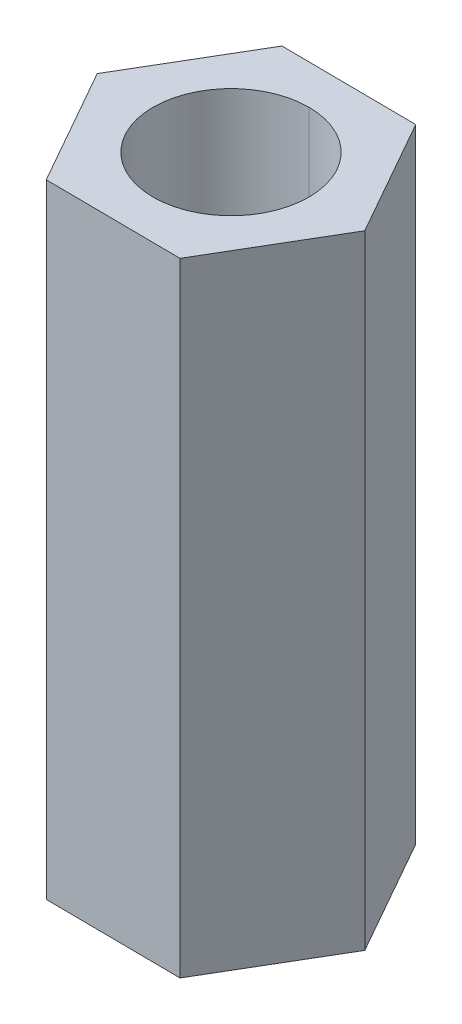
ISO-10303-21;
HEADER;
FILE_DESCRIPTION(('STEP AP214'),'2;1');
FILE_NAME('part.step','',(''),(''),'','','');
FILE_SCHEMA(('AUTOMOTIVE_DESIGN { 1 0 10303 214 1 1 1 1 }'));
ENDSEC;
DATA;
#1=APPLICATION_CONTEXT('core data for automotive mechanical design processes');
#2=APPLICATION_PROTOCOL_DEFINITION('international standard','automotive_design',2000,#1);
#3=PRODUCT_CONTEXT('',#1,'mechanical');
#4=PRODUCT('Part','Part','',(#3));
#5=PRODUCT_RELATED_PRODUCT_CATEGORY('part','',(#4));
#6=PRODUCT_DEFINITION_FORMATION('','',#4);
#7=PRODUCT_DEFINITION_CONTEXT('part definition',#1,'design');
#8=PRODUCT_DEFINITION('design','',#6,#7);
#9=PRODUCT_DEFINITION_SHAPE('','',#8);
#10=(LENGTH_UNIT() NAMED_UNIT(*) SI_UNIT(.MILLI.,.METRE.));
#11=(NAMED_UNIT(*) PLANE_ANGLE_UNIT() SI_UNIT($,.RADIAN.));
#12=(NAMED_UNIT(*) SI_UNIT($,.STERADIAN.) SOLID_ANGLE_UNIT());
#13=UNCERTAINTY_MEASURE_WITH_UNIT(LENGTH_MEASURE(1.E-05),#10,'distance_accuracy_value','');
#14=(GEOMETRIC_REPRESENTATION_CONTEXT(3) GLOBAL_UNCERTAINTY_ASSIGNED_CONTEXT((#13)) GLOBAL_UNIT_ASSIGNED_CONTEXT((#10,
#11,#12)) REPRESENTATION_CONTEXT('',''));
#15=CARTESIAN_POINT('',(0.,0.,0.));
#16=DIRECTION('',(0.,0.,1.));
#17=DIRECTION('',(1.,0.,0.));
#18=AXIS2_PLACEMENT_3D('',#15,#16,#17);
#19=CARTESIAN_POINT('',(0.,12.,0.));
#20=DIRECTION('',(0.,-1.,0.));
#21=DIRECTION('',(0.,0.,-1.));
#22=AXIS2_PLACEMENT_3D('',#19,#20,#21);
#23=CYLINDRICAL_SURFACE('',#22,1.5);
#24=CARTESIAN_POINT('',(0.,12.,0.));
#25=DIRECTION('',(0.,1.,0.));
#26=DIRECTION('',(0.,0.,1.));
#27=AXIS2_PLACEMENT_3D('',#24,#25,#26);
#28=CIRCLE('',#27,1.5);
#29=CARTESIAN_POINT('',(0.,12.,-1.5));
#30=VERTEX_POINT('',#29);
#31=CARTESIAN_POINT('',(0.,12.,1.5));
#32=VERTEX_POINT('',#31);
#33=EDGE_CURVE('E11',#30,#32,#28,.T.);
#34=ORIENTED_EDGE('',*,*,#33,.T.);
#35=DIRECTION('',(0.,-1.,0.));
#36=VECTOR('',#35,1.);
#37=CARTESIAN_POINT('',(0.,12.,1.5));
#38=LINE('',#37,#36);
#39=CARTESIAN_POINT('',(0.,0.,1.5));
#40=VERTEX_POINT('',#39);
#41=EDGE_CURVE('E27',#32,#40,#38,.T.);
#42=ORIENTED_EDGE('',*,*,#41,.T.);
#43=CARTESIAN_POINT('',(0.,0.,0.));
#44=DIRECTION('',(0.,1.,0.));
#45=DIRECTION('',(0.,0.,1.));
#46=AXIS2_PLACEMENT_3D('',#43,#44,#45);
#47=CIRCLE('',#46,1.5);
#48=CARTESIAN_POINT('',(0.,0.,-1.5));
#49=VERTEX_POINT('',#48);
#50=EDGE_CURVE('E20',#49,#40,#47,.T.);
#51=ORIENTED_EDGE('',*,*,#50,.F.);
#52=DIRECTION('',(0.,-1.,0.));
#53=VECTOR('',#52,1.);
#54=CARTESIAN_POINT('',(0.,12.,-1.5));
#55=LINE('',#54,#53);
#56=EDGE_CURVE('E101',#30,#49,#55,.T.);
#57=ORIENTED_EDGE('',*,*,#56,.F.);
#58=EDGE_LOOP('',(#34,#42,#51,#57));
#59=FACE_BOUND('',#58,.T.);
#60=ADVANCED_FACE('F16',(#59),#23,.F.);
#61=CARTESIAN_POINT('',(0.,12.,0.));
#62=DIRECTION('',(0.,1.,0.));
#63=DIRECTION('',(1.,0.,0.));
#64=AXIS2_PLACEMENT_3D('',#61,#62,#63);
#65=PLANE('',#64);
#66=DIRECTION('',(-0.4924858619026,0.,-0.870320444334185));
#67=VECTOR('',#66,1.);
#68=CARTESIAN_POINT('',(2.5979789008704,12.,0.0224862320586959));
#69=LINE('',#68,#67);
#70=CARTESIAN_POINT('',(2.5979789008704,12.,0.0224862320586959));
#71=VERTEX_POINT('',#70);
#72=CARTESIAN_POINT('',(1.31846309863343,12.,-2.23867261062039));
#73=VERTEX_POINT('',#72);
#74=EDGE_CURVE('E164',#71,#73,#69,.T.);
#75=ORIENTED_EDGE('',*,*,#74,.T.);
#76=DIRECTION('',(-0.999962545177665,0.,-0.00865495475476602));
#77=VECTOR('',#76,1.);
#78=CARTESIAN_POINT('',(1.31846309863343,12.,-2.23867261062039));
#79=LINE('',#78,#77);
#80=CARTESIAN_POINT('',(-1.27951580223698,12.,-2.26115884267909));
#81=VERTEX_POINT('',#80);
#82=EDGE_CURVE('E161',#73,#81,#79,.T.);
#83=ORIENTED_EDGE('',*,*,#82,.T.);
#84=DIRECTION('',(-0.507476683275064,0.,0.861665489579419));
#85=VECTOR('',#84,1.);
#86=CARTESIAN_POINT('',(-1.27951580223698,12.,-2.26115884267909));
#87=LINE('',#86,#85);
#88=CARTESIAN_POINT('',(-2.5979789008704,12.,-0.0224862320586956));
#89=VERTEX_POINT('',#88);
#90=EDGE_CURVE('E144',#81,#89,#87,.T.);
#91=ORIENTED_EDGE('',*,*,#90,.T.);
#92=DIRECTION('',(0.4924858619026,0.,0.870320444334185));
#93=VECTOR('',#92,1.);
#94=CARTESIAN_POINT('',(-2.5979789008704,12.,-0.0224862320586956));
#95=LINE('',#94,#93);
#96=CARTESIAN_POINT('',(-1.31846309863343,12.,2.23867261062039));
#97=VERTEX_POINT('',#96);
#98=EDGE_CURVE('E141',#89,#97,#95,.T.);
#99=ORIENTED_EDGE('',*,*,#98,.T.);
#100=DIRECTION('',(0.999962545177665,0.,0.00865495475476585));
#101=VECTOR('',#100,1.);
#102=CARTESIAN_POINT('',(-1.31846309863343,12.,2.23867261062039));
#103=LINE('',#102,#101);
#104=CARTESIAN_POINT('',(1.27951580223698,12.,2.26115884267909));
#105=VERTEX_POINT('',#104);
#106=EDGE_CURVE('E145',#97,#105,#103,.T.);
#107=ORIENTED_EDGE('',*,*,#106,.T.);
#108=DIRECTION('',(0.507476683275064,0.,-0.861665489579419));
#109=VECTOR('',#108,1.);
#110=CARTESIAN_POINT('',(1.27951580223698,12.,2.26115884267909));
#111=LINE('',#110,#109);
#112=EDGE_CURVE('E115',#105,#71,#111,.T.);
#113=ORIENTED_EDGE('',*,*,#112,.T.);
#114=EDGE_LOOP('',(#75,#83,#91,#99,#107,#113));
#115=FACE_BOUND('',#114,.T.);
#116=ORIENTED_EDGE('',*,*,#33,.F.);
#117=CARTESIAN_POINT('',(0.,12.,0.));
#118=DIRECTION('',(0.,1.,0.));
#119=DIRECTION('',(0.,0.,1.));
#120=AXIS2_PLACEMENT_3D('',#117,#118,#119);
#121=CIRCLE('',#120,1.5);
#122=EDGE_CURVE('E110',#32,#30,#121,.T.);
#123=ORIENTED_EDGE('',*,*,#122,.F.);
#124=EDGE_LOOP('',(#116,#123));
#125=FACE_BOUND('',#124,.T.);
#126=ADVANCED_FACE('F178',(#115,#125),#65,.T.);
#127=CARTESIAN_POINT('',(0.,0.,0.));
#128=DIRECTION('',(0.,1.,0.));
#129=DIRECTION('',(1.,0.,0.));
#130=AXIS2_PLACEMENT_3D('',#127,#128,#129);
#131=PLANE('',#130);
#132=DIRECTION('',(-0.4924858619026,0.,-0.870320444334185));
#133=VECTOR('',#132,1.);
#134=CARTESIAN_POINT('',(2.5979789008704,0.,0.0224862320586959));
#135=LINE('',#134,#133);
#136=CARTESIAN_POINT('',(2.5979789008704,0.,0.0224862320586959));
#137=VERTEX_POINT('',#136);
#138=CARTESIAN_POINT('',(1.31846309863343,0.,-2.23867261062039));
#139=VERTEX_POINT('',#138);
#140=EDGE_CURVE('E118',#137,#139,#135,.T.);
#141=ORIENTED_EDGE('',*,*,#140,.F.);
#142=DIRECTION('',(0.507476683275064,0.,-0.861665489579419));
#143=VECTOR('',#142,1.);
#144=CARTESIAN_POINT('',(1.27951580223698,0.,2.26115884267909));
#145=LINE('',#144,#143);
#146=CARTESIAN_POINT('',(1.27951580223698,0.,2.26115884267909));
#147=VERTEX_POINT('',#146);
#148=EDGE_CURVE('E136',#147,#137,#145,.T.);
#149=ORIENTED_EDGE('',*,*,#148,.F.);
#150=DIRECTION('',(0.999962545177665,0.,0.00865495475476585));
#151=VECTOR('',#150,1.);
#152=CARTESIAN_POINT('',(-1.31846309863343,0.,2.23867261062039));
#153=LINE('',#152,#151);
#154=CARTESIAN_POINT('',(-1.31846309863343,0.,2.23867261062039));
#155=VERTEX_POINT('',#154);
#156=EDGE_CURVE('E135',#155,#147,#153,.T.);
#157=ORIENTED_EDGE('',*,*,#156,.F.);
#158=DIRECTION('',(0.4924858619026,0.,0.870320444334185));
#159=VECTOR('',#158,1.);
#160=CARTESIAN_POINT('',(-2.5979789008704,0.,-0.0224862320586956));
#161=LINE('',#160,#159);
#162=CARTESIAN_POINT('',(-2.5979789008704,0.,-0.0224862320586956));
#163=VERTEX_POINT('',#162);
#164=EDGE_CURVE('E157',#163,#155,#161,.T.);
#165=ORIENTED_EDGE('',*,*,#164,.F.);
#166=DIRECTION('',(-0.507476683275064,0.,0.861665489579419));
#167=VECTOR('',#166,1.);
#168=CARTESIAN_POINT('',(-1.27951580223698,0.,-2.26115884267909));
#169=LINE('',#168,#167);
#170=CARTESIAN_POINT('',(-1.27951580223698,0.,-2.26115884267909));
#171=VERTEX_POINT('',#170);
#172=EDGE_CURVE('E204',#171,#163,#169,.T.);
#173=ORIENTED_EDGE('',*,*,#172,.F.);
#174=DIRECTION('',(-0.999962545177665,0.,-0.00865495475476602));
#175=VECTOR('',#174,1.);
#176=CARTESIAN_POINT('',(1.31846309863343,0.,-2.23867261062039));
#177=LINE('',#176,#175);
#178=EDGE_CURVE('E140',#139,#171,#177,.T.);
#179=ORIENTED_EDGE('',*,*,#178,.F.);
#180=EDGE_LOOP('',(#141,#149,#157,#165,#173,#179));
#181=FACE_BOUND('',#180,.T.);
#182=ORIENTED_EDGE('',*,*,#50,.T.);
#183=CARTESIAN_POINT('',(0.,0.,0.));
#184=DIRECTION('',(0.,1.,0.));
#185=DIRECTION('',(0.,0.,1.));
#186=AXIS2_PLACEMENT_3D('',#183,#184,#185);
#187=CIRCLE('',#186,1.5);
#188=EDGE_CURVE('E108',#40,#49,#187,.T.);
#189=ORIENTED_EDGE('',*,*,#188,.T.);
#190=EDGE_LOOP('',(#182,#189));
#191=FACE_BOUND('',#190,.T.);
#192=ADVANCED_FACE('F116',(#181,#191),#131,.F.);
#193=CARTESIAN_POINT('',(2.5979789008704,12.,0.0224862320586959));
#194=DIRECTION('',(-0.870320444334185,0.,0.4924858619026));
#195=DIRECTION('',(0.,1.,0.));
#196=AXIS2_PLACEMENT_3D('',#193,#194,#195);
#197=PLANE('',#196);
#198=ORIENTED_EDGE('',*,*,#140,.T.);
#199=DIRECTION('',(0.,-1.,0.));
#200=VECTOR('',#199,1.);
#201=CARTESIAN_POINT('',(1.31846309863343,12.,-2.23867261062039));
#202=LINE('',#201,#200);
#203=EDGE_CURVE('E152',#73,#139,#202,.T.);
#204=ORIENTED_EDGE('',*,*,#203,.F.);
#205=ORIENTED_EDGE('',*,*,#74,.F.);
#206=DIRECTION('',(0.,-1.,0.));
#207=VECTOR('',#206,1.);
#208=CARTESIAN_POINT('',(2.5979789008704,12.,0.0224862320586959));
#209=LINE('',#208,#207);
#210=EDGE_CURVE('E126',#71,#137,#209,.T.);
#211=ORIENTED_EDGE('',*,*,#210,.T.);
#212=EDGE_LOOP('',(#198,#204,#205,#211));
#213=FACE_BOUND('',#212,.T.);
#214=ADVANCED_FACE('F235',(#213),#197,.F.);
#215=CARTESIAN_POINT('',(1.31846309863343,12.,-2.23867261062039));
#216=DIRECTION('',(-0.00865495475476602,0.,0.999962545177665));
#217=DIRECTION('',(0.,1.,0.));
#218=AXIS2_PLACEMENT_3D('',#215,#216,#217);
#219=PLANE('',#218);
#220=ORIENTED_EDGE('',*,*,#178,.T.);
#221=DIRECTION('',(0.,-1.,0.));
#222=VECTOR('',#221,1.);
#223=CARTESIAN_POINT('',(-1.27951580223698,12.,-2.26115884267909));
#224=LINE('',#223,#222);
#225=EDGE_CURVE('E198',#81,#171,#224,.T.);
#226=ORIENTED_EDGE('',*,*,#225,.F.);
#227=ORIENTED_EDGE('',*,*,#82,.F.);
#228=ORIENTED_EDGE('',*,*,#203,.T.);
#229=EDGE_LOOP('',(#220,#226,#227,#228));
#230=FACE_BOUND('',#229,.T.);
#231=ADVANCED_FACE('F232',(#230),#219,.F.);
#232=CARTESIAN_POINT('',(-1.27951580223698,12.,-2.26115884267909));
#233=DIRECTION('',(0.861665489579419,0.,0.507476683275064));
#234=DIRECTION('',(0.,-1.,0.));
#235=AXIS2_PLACEMENT_3D('',#232,#233,#234);
#236=PLANE('',#235);
#237=ORIENTED_EDGE('',*,*,#172,.T.);
#238=DIRECTION('',(0.,-1.,0.));
#239=VECTOR('',#238,1.);
#240=CARTESIAN_POINT('',(-2.5979789008704,12.,-0.0224862320586956));
#241=LINE('',#240,#239);
#242=EDGE_CURVE('E153',#89,#163,#241,.T.);
#243=ORIENTED_EDGE('',*,*,#242,.F.);
#244=ORIENTED_EDGE('',*,*,#90,.F.);
#245=ORIENTED_EDGE('',*,*,#225,.T.);
#246=EDGE_LOOP('',(#237,#243,#244,#245));
#247=FACE_BOUND('',#246,.T.);
#248=ADVANCED_FACE('F18',(#247),#236,.F.);
#249=CARTESIAN_POINT('',(-2.5979789008704,12.,-0.0224862320586956));
#250=DIRECTION('',(0.870320444334185,0.,-0.4924858619026));
#251=DIRECTION('',(0.,-1.,0.));
#252=AXIS2_PLACEMENT_3D('',#249,#250,#251);
#253=PLANE('',#252);
#254=ORIENTED_EDGE('',*,*,#164,.T.);
#255=DIRECTION('',(0.,-1.,0.));
#256=VECTOR('',#255,1.);
#257=CARTESIAN_POINT('',(-1.31846309863343,12.,2.23867261062039));
#258=LINE('',#257,#256);
#259=EDGE_CURVE('E132',#97,#155,#258,.T.);
#260=ORIENTED_EDGE('',*,*,#259,.F.);
#261=ORIENTED_EDGE('',*,*,#98,.F.);
#262=ORIENTED_EDGE('',*,*,#242,.T.);
#263=EDGE_LOOP('',(#254,#260,#261,#262));
#264=FACE_BOUND('',#263,.T.);
#265=ADVANCED_FACE('F242',(#264),#253,.F.);
#266=CARTESIAN_POINT('',(-1.31846309863343,12.,2.23867261062039));
#267=DIRECTION('',(0.00865495475476585,0.,-0.999962545177665));
#268=DIRECTION('',(0.,-1.,0.));
#269=AXIS2_PLACEMENT_3D('',#266,#267,#268);
#270=PLANE('',#269);
#271=ORIENTED_EDGE('',*,*,#156,.T.);
#272=DIRECTION('',(0.,-1.,0.));
#273=VECTOR('',#272,1.);
#274=CARTESIAN_POINT('',(1.27951580223698,12.,2.26115884267909));
#275=LINE('',#274,#273);
#276=EDGE_CURVE('E130',#105,#147,#275,.T.);
#277=ORIENTED_EDGE('',*,*,#276,.F.);
#278=ORIENTED_EDGE('',*,*,#106,.F.);
#279=ORIENTED_EDGE('',*,*,#259,.T.);
#280=EDGE_LOOP('',(#271,#277,#278,#279));
#281=FACE_BOUND('',#280,.T.);
#282=ADVANCED_FACE('F185',(#281),#270,.F.);
#283=CARTESIAN_POINT('',(1.27951580223698,12.,2.26115884267909));
#284=DIRECTION('',(-0.861665489579419,0.,-0.507476683275064));
#285=DIRECTION('',(-0.507476683275064,0.,0.861665489579419));
#286=AXIS2_PLACEMENT_3D('',#283,#284,#285);
#287=PLANE('',#286);
#288=ORIENTED_EDGE('',*,*,#148,.T.);
#289=ORIENTED_EDGE('',*,*,#210,.F.);
#290=ORIENTED_EDGE('',*,*,#112,.F.);
#291=ORIENTED_EDGE('',*,*,#276,.T.);
#292=EDGE_LOOP('',(#288,#289,#290,#291));
#293=FACE_BOUND('',#292,.T.);
#294=ADVANCED_FACE('F250',(#293),#287,.F.);
#295=CARTESIAN_POINT('',(0.,12.,0.));
#296=DIRECTION('',(0.,-1.,0.));
#297=DIRECTION('',(0.,0.,-1.));
#298=AXIS2_PLACEMENT_3D('',#295,#296,#297);
#299=CYLINDRICAL_SURFACE('',#298,1.5);
#300=ORIENTED_EDGE('',*,*,#41,.F.);
#301=ORIENTED_EDGE('',*,*,#122,.T.);
#302=ORIENTED_EDGE('',*,*,#56,.T.);
#303=ORIENTED_EDGE('',*,*,#188,.F.);
#304=EDGE_LOOP('',(#300,#301,#302,#303));
#305=FACE_BOUND('',#304,.T.);
#306=ADVANCED_FACE('F106',(#305),#299,.F.);
#307=CLOSED_SHELL('',(#60,#126,#192,#214,#231,#248,#265,#282,#294,#306));
#308=MANIFOLD_SOLID_BREP('B1',#307);
#309=ADVANCED_BREP_SHAPE_REPRESENTATION('',(#18,#308),#14);
#310=SHAPE_DEFINITION_REPRESENTATION(#9,#309);
ENDSEC;
END-ISO-10303-21;
